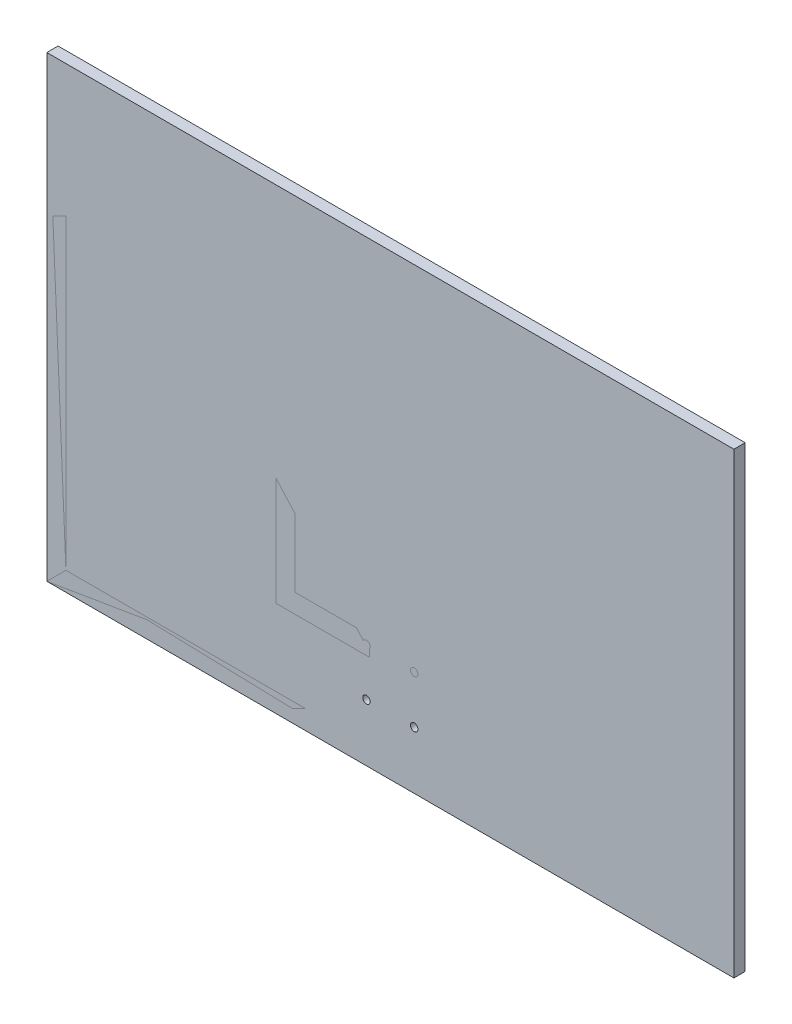
ISO-10303-21;
HEADER;
FILE_DESCRIPTION(('STEP AP214'),'2;1');
FILE_NAME('part.step','',(''),(''),'','','');
FILE_SCHEMA(('AUTOMOTIVE_DESIGN { 1 0 10303 214 1 1 1 1 }'));
ENDSEC;
DATA;
#1=APPLICATION_CONTEXT('core data for automotive mechanical design processes');
#2=APPLICATION_PROTOCOL_DEFINITION('international standard','automotive_design',2000,#1);
#3=PRODUCT_CONTEXT('',#1,'mechanical');
#4=PRODUCT('Part','Part','',(#3));
#5=PRODUCT_RELATED_PRODUCT_CATEGORY('part','',(#4));
#6=PRODUCT_DEFINITION_FORMATION('','',#4);
#7=PRODUCT_DEFINITION_CONTEXT('part definition',#1,'design');
#8=PRODUCT_DEFINITION('design','',#6,#7);
#9=PRODUCT_DEFINITION_SHAPE('','',#8);
#10=(LENGTH_UNIT() NAMED_UNIT(*) SI_UNIT(.MILLI.,.METRE.));
#11=(NAMED_UNIT(*) PLANE_ANGLE_UNIT() SI_UNIT($,.RADIAN.));
#12=(NAMED_UNIT(*) SI_UNIT($,.STERADIAN.) SOLID_ANGLE_UNIT());
#13=UNCERTAINTY_MEASURE_WITH_UNIT(LENGTH_MEASURE(1.E-05),#10,'distance_accuracy_value','');
#14=(GEOMETRIC_REPRESENTATION_CONTEXT(3) GLOBAL_UNCERTAINTY_ASSIGNED_CONTEXT((#13)) GLOBAL_UNIT_ASSIGNED_CONTEXT((#10,
#11,#12)) REPRESENTATION_CONTEXT('',''));
#15=CARTESIAN_POINT('',(0.,0.,0.));
#16=DIRECTION('',(0.,0.,1.));
#17=DIRECTION('',(1.,0.,0.));
#18=AXIS2_PLACEMENT_3D('',#15,#16,#17);
#19=CARTESIAN_POINT('',(0.,0.,30.));
#20=DIRECTION('',(0.,0.,-1.));
#21=DIRECTION('',(-1.,0.,0.));
#22=AXIS2_PLACEMENT_3D('',#19,#20,#21);
#23=PLANE('',#22);
#24=DIRECTION('',(0.,1.,0.));
#25=VECTOR('',#24,1.);
#26=CARTESIAN_POINT('',(-609.7,254.2,30.));
#27=LINE('',#26,#25);
#28=CARTESIAN_POINT('',(-609.7,254.2,30.));
#29=VERTEX_POINT('',#28);
#30=CARTESIAN_POINT('',(-609.7,711.4,30.));
#31=VERTEX_POINT('',#30);
#32=EDGE_CURVE('E84',#29,#31,#27,.T.);
#33=ORIENTED_EDGE('',*,*,#32,.T.);
#34=DIRECTION('',(-1.,0.,0.));
#35=VECTOR('',#34,1.);
#36=CARTESIAN_POINT('',(-1219.3,711.4,30.));
#37=LINE('',#36,#35);
#38=CARTESIAN_POINT('',(-1219.3,711.4,30.));
#39=VERTEX_POINT('',#38);
#40=EDGE_CURVE('E86',#31,#39,#37,.T.);
#41=ORIENTED_EDGE('',*,*,#40,.T.);
#42=DIRECTION('',(0.,-1.,0.));
#43=VECTOR('',#42,1.);
#44=CARTESIAN_POINT('',(-1219.3,254.2,30.));
#45=LINE('',#44,#43);
#46=CARTESIAN_POINT('',(-1219.3,254.2,30.));
#47=VERTEX_POINT('',#46);
#48=EDGE_CURVE('E93',#39,#47,#45,.T.);
#49=ORIENTED_EDGE('',*,*,#48,.T.);
#50=DIRECTION('',(1.,0.,0.));
#51=VECTOR('',#50,1.);
#52=CARTESIAN_POINT('',(-1219.3,254.2,30.));
#53=LINE('',#52,#51);
#54=EDGE_CURVE('E89',#47,#29,#53,.T.);
#55=ORIENTED_EDGE('',*,*,#54,.T.);
#56=EDGE_LOOP('',(#33,#41,#49,#55));
#57=FACE_BOUND('',#56,.T.);
#58=DIRECTION('',(0.,-1.,0.));
#59=VECTOR('',#58,1.);
#60=CARTESIAN_POINT('',(-1168.5,660.6,30.));
#61=LINE('',#60,#59);
#62=CARTESIAN_POINT('',(-1168.5,660.6,30.));
#63=VERTEX_POINT('',#62);
#64=CARTESIAN_POINT('',(-1168.5,305.,30.));
#65=VERTEX_POINT('',#64);
#66=EDGE_CURVE('E60',#63,#65,#61,.T.);
#67=ORIENTED_EDGE('',*,*,#66,.F.);
#68=DIRECTION('',(-1.,0.,0.));
#69=VECTOR('',#68,1.);
#70=CARTESIAN_POINT('',(-1168.5,660.6,30.));
#71=LINE('',#70,#69);
#72=CARTESIAN_POINT('',(-660.5,660.6,30.));
#73=VERTEX_POINT('',#72);
#74=EDGE_CURVE('E104',#73,#63,#71,.T.);
#75=ORIENTED_EDGE('',*,*,#74,.F.);
#76=DIRECTION('',(0.,1.,0.));
#77=VECTOR('',#76,1.);
#78=CARTESIAN_POINT('',(-660.5,660.6,30.));
#79=LINE('',#78,#77);
#80=CARTESIAN_POINT('',(-660.499999999999,305.,30.));
#81=VERTEX_POINT('',#80);
#82=EDGE_CURVE('E56',#81,#73,#79,.T.);
#83=ORIENTED_EDGE('',*,*,#82,.F.);
#84=DIRECTION('',(1.,0.,0.));
#85=VECTOR('',#84,1.);
#86=CARTESIAN_POINT('',(-1168.5,305.,30.));
#87=LINE('',#86,#85);
#88=EDGE_CURVE('E12',#65,#81,#87,.T.);
#89=ORIENTED_EDGE('',*,*,#88,.F.);
#90=EDGE_LOOP('',(#67,#75,#83,#89));
#91=FACE_BOUND('',#90,.T.);
#92=ADVANCED_FACE('F51',(#57,#91),#23,.F.);
#93=OPEN_SHELL('',(#92));
#94=SHELL_BASED_SURFACE_MODEL('B2',(#93));
#95=CARTESIAN_POINT('',(0.,0.,30.));
#96=DIRECTION('',(0.,0.,1.));
#97=DIRECTION('',(1.,0.,0.));
#98=AXIS2_PLACEMENT_3D('',#95,#96,#97);
#99=PLANE('',#98);
#100=DIRECTION('',(0.,-1.,0.));
#101=VECTOR('',#100,1.);
#102=CARTESIAN_POINT('',(-1778.2,1168.2,30.));
#103=LINE('',#102,#101);
#104=CARTESIAN_POINT('',(-1778.2,1168.2,30.));
#105=VERTEX_POINT('',#104);
#106=CARTESIAN_POINT('',(-1778.2,50.8,30.));
#107=VERTEX_POINT('',#106);
#108=EDGE_CURVE('E173',#105,#107,#103,.T.);
#109=ORIENTED_EDGE('',*,*,#108,.F.);
#110=DIRECTION('',(-1.,0.,0.));
#111=VECTOR('',#110,1.);
#112=CARTESIAN_POINT('',(-1778.2,1168.2,30.));
#113=LINE('',#112,#111);
#114=CARTESIAN_POINT('',(-50.8000000000002,1168.2,30.));
#115=VERTEX_POINT('',#114);
#116=EDGE_CURVE('E175',#115,#105,#113,.T.);
#117=ORIENTED_EDGE('',*,*,#116,.F.);
#118=DIRECTION('',(0.,1.,0.));
#119=VECTOR('',#118,1.);
#120=CARTESIAN_POINT('',(-50.8000000000002,1168.2,30.));
#121=LINE('',#120,#119);
#122=CARTESIAN_POINT('',(-50.8000000000002,50.7999999999997,30.));
#123=VERTEX_POINT('',#122);
#124=EDGE_CURVE('E182',#123,#115,#121,.T.);
#125=ORIENTED_EDGE('',*,*,#124,.F.);
#126=DIRECTION('',(1.,0.,0.));
#127=VECTOR('',#126,1.);
#128=CARTESIAN_POINT('',(-1778.2,50.8,30.));
#129=LINE('',#128,#127);
#130=EDGE_CURVE('E178',#107,#123,#129,.T.);
#131=ORIENTED_EDGE('',*,*,#130,.F.);
#132=EDGE_LOOP('',(#109,#117,#125,#131));
#133=FACE_BOUND('',#132,.T.);
#134=DIRECTION('',(0.,-1.,0.));
#135=VECTOR('',#134,1.);
#136=CARTESIAN_POINT('',(-1829.,1219.,30.));
#137=LINE('',#136,#135);
#138=CARTESIAN_POINT('',(-1829.,1219.,30.));
#139=VERTEX_POINT('',#138);
#140=CARTESIAN_POINT('',(-1829.,-2.27661839961493E-13,30.));
#141=VERTEX_POINT('',#140);
#142=EDGE_CURVE('E149',#139,#141,#137,.T.);
#143=ORIENTED_EDGE('',*,*,#142,.T.);
#144=DIRECTION('',(1.,0.,0.));
#145=VECTOR('',#144,1.);
#146=CARTESIAN_POINT('',(-1829.,-2.27661839961493E-13,30.));
#147=LINE('',#146,#145);
#148=CARTESIAN_POINT('',(0.,0.,30.));
#149=VERTEX_POINT('',#148);
#150=EDGE_CURVE('E193',#141,#149,#147,.T.);
#151=ORIENTED_EDGE('',*,*,#150,.T.);
#152=DIRECTION('',(0.,1.,0.));
#153=VECTOR('',#152,1.);
#154=CARTESIAN_POINT('',(0.,1219.,30.));
#155=LINE('',#154,#153);
#156=CARTESIAN_POINT('',(0.,1219.,30.));
#157=VERTEX_POINT('',#156);
#158=EDGE_CURVE('E145',#149,#157,#155,.T.);
#159=ORIENTED_EDGE('',*,*,#158,.T.);
#160=DIRECTION('',(-1.,0.,0.));
#161=VECTOR('',#160,1.);
#162=CARTESIAN_POINT('',(-1829.,1219.,30.));
#163=LINE('',#162,#161);
#164=EDGE_CURVE('E49',#157,#139,#163,.T.);
#165=ORIENTED_EDGE('',*,*,#164,.T.);
#166=EDGE_LOOP('',(#143,#151,#159,#165));
#167=FACE_BOUND('',#166,.T.);
#168=ADVANCED_FACE('F140',(#133,#167),#99,.T.);
#169=OPEN_SHELL('',(#168));
#170=SHELL_BASED_SURFACE_MODEL('B6',(#169));
#171=CARTESIAN_POINT('',(-1829.,0.,0.));
#172=DIRECTION('',(0.,0.,-1.));
#173=DIRECTION('',(-1.,0.,0.));
#174=AXIS2_PLACEMENT_3D('',#171,#172,#173);
#175=PLANE('',#174);
#176=CARTESIAN_POINT('',(-978.,152.6,0.));
#177=DIRECTION('',(0.,0.,1.));
#178=DIRECTION('',(-1.,0.,0.));
#179=AXIS2_PLACEMENT_3D('',#176,#177,#178);
#180=CIRCLE('',#179,10.0000000000001);
#181=CARTESIAN_POINT('',(-988.,152.6,0.));
#182=VERTEX_POINT('',#181);
#183=EDGE_CURVE('E353',#182,#182,#180,.T.);
#184=ORIENTED_EDGE('',*,*,#183,.T.);
#185=EDGE_LOOP('',(#184));
#186=FACE_BOUND('',#185,.T.);
#187=CARTESIAN_POINT('',(-851.,152.6,0.));
#188=DIRECTION('',(0.,0.,1.));
#189=DIRECTION('',(-1.,0.,0.));
#190=AXIS2_PLACEMENT_3D('',#187,#188,#189);
#191=CIRCLE('',#190,10.0000000000001);
#192=CARTESIAN_POINT('',(-861.,152.6,0.));
#193=VERTEX_POINT('',#192);
#194=EDGE_CURVE('E343',#193,#193,#191,.T.);
#195=ORIENTED_EDGE('',*,*,#194,.T.);
#196=EDGE_LOOP('',(#195));
#197=FACE_BOUND('',#196,.T.);
#198=CARTESIAN_POINT('',(-851.,279.6,0.));
#199=DIRECTION('',(0.,0.,1.));
#200=DIRECTION('',(1.,0.,0.));
#201=AXIS2_PLACEMENT_3D('',#198,#199,#200);
#202=CIRCLE('',#201,9.99999999999998);
#203=CARTESIAN_POINT('',(-841.,279.6,0.));
#204=VERTEX_POINT('',#203);
#205=EDGE_CURVE('E338',#204,#204,#202,.T.);
#206=ORIENTED_EDGE('',*,*,#205,.T.);
#207=EDGE_LOOP('',(#206));
#208=FACE_BOUND('',#207,.T.);
#209=CARTESIAN_POINT('',(-978.,279.6,0.));
#210=DIRECTION('',(0.,0.,1.));
#211=DIRECTION('',(1.,0.,0.));
#212=AXIS2_PLACEMENT_3D('',#209,#210,#211);
#213=CIRCLE('',#212,9.99999999999998);
#214=CARTESIAN_POINT('',(-968.,279.6,0.));
#215=VERTEX_POINT('',#214);
#216=EDGE_CURVE('E289',#215,#215,#213,.T.);
#217=ORIENTED_EDGE('',*,*,#216,.T.);
#218=EDGE_LOOP('',(#217));
#219=FACE_BOUND('',#218,.T.);
#220=DIRECTION('',(0.,1.,0.));
#221=VECTOR('',#220,1.);
#222=CARTESIAN_POINT('',(0.,0.,0.));
#223=LINE('',#222,#221);
#224=CARTESIAN_POINT('',(0.,0.,0.));
#225=VERTEX_POINT('',#224);
#226=CARTESIAN_POINT('',(0.,1219.,0.));
#227=VERTEX_POINT('',#226);
#228=EDGE_CURVE('E285',#225,#227,#223,.T.);
#229=ORIENTED_EDGE('',*,*,#228,.F.);
#230=DIRECTION('',(1.,0.,0.));
#231=VECTOR('',#230,1.);
#232=CARTESIAN_POINT('',(-1829.,0.,0.));
#233=LINE('',#232,#231);
#234=CARTESIAN_POINT('',(-1829.,0.,0.));
#235=VERTEX_POINT('',#234);
#236=EDGE_CURVE('E138',#235,#225,#233,.T.);
#237=ORIENTED_EDGE('',*,*,#236,.F.);
#238=DIRECTION('',(0.,1.,0.));
#239=VECTOR('',#238,1.);
#240=CARTESIAN_POINT('',(-1829.,0.,0.));
#241=LINE('',#240,#239);
#242=CARTESIAN_POINT('',(-1829.,1219.,0.));
#243=VERTEX_POINT('',#242);
#244=EDGE_CURVE('E278',#235,#243,#241,.T.);
#245=ORIENTED_EDGE('',*,*,#244,.T.);
#246=DIRECTION('',(1.,0.,0.));
#247=VECTOR('',#246,1.);
#248=CARTESIAN_POINT('',(-1829.,1219.,0.));
#249=LINE('',#248,#247);
#250=EDGE_CURVE('E223',#243,#227,#249,.T.);
#251=ORIENTED_EDGE('',*,*,#250,.T.);
#252=EDGE_LOOP('',(#229,#237,#245,#251));
#253=FACE_BOUND('',#252,.T.);
#254=ADVANCED_FACE('F220',(#186,#197,#208,#219,#253),#175,.T.);
#255=CARTESIAN_POINT('',(-1829.,0.,0.));
#256=DIRECTION('',(0.,-1.,0.));
#257=DIRECTION('',(0.,0.,-1.));
#258=AXIS2_PLACEMENT_3D('',#255,#256,#257);
#259=PLANE('',#258);
#260=DIRECTION('',(0.,0.,-1.));
#261=VECTOR('',#260,1.);
#262=CARTESIAN_POINT('',(0.,0.,0.));
#263=LINE('',#262,#261);
#264=CARTESIAN_POINT('',(0.,0.,30.));
#265=VERTEX_POINT('',#264);
#266=EDGE_CURVE('E280',#265,#225,#263,.T.);
#267=ORIENTED_EDGE('',*,*,#266,.F.);
#268=DIRECTION('',(1.,0.,0.));
#269=VECTOR('',#268,1.);
#270=CARTESIAN_POINT('',(-1829.,0.,30.));
#271=LINE('',#270,#269);
#272=CARTESIAN_POINT('',(-1829.,0.,30.));
#273=VERTEX_POINT('',#272);
#274=EDGE_CURVE('E229',#273,#265,#271,.T.);
#275=ORIENTED_EDGE('',*,*,#274,.F.);
#276=DIRECTION('',(0.,0.,-1.));
#277=VECTOR('',#276,1.);
#278=CARTESIAN_POINT('',(-1829.,0.,0.));
#279=LINE('',#278,#277);
#280=EDGE_CURVE('E275',#273,#235,#279,.T.);
#281=ORIENTED_EDGE('',*,*,#280,.T.);
#282=ORIENTED_EDGE('',*,*,#236,.T.);
#283=EDGE_LOOP('',(#267,#275,#281,#282));
#284=FACE_BOUND('',#283,.T.);
#285=ADVANCED_FACE('F296',(#284),#259,.T.);
#286=CARTESIAN_POINT('',(-1829.,0.,30.));
#287=DIRECTION('',(0.,0.,1.));
#288=DIRECTION('',(1.,0.,0.));
#289=AXIS2_PLACEMENT_3D('',#286,#287,#288);
#290=PLANE('',#289);
#291=CARTESIAN_POINT('',(-978.,152.6,30.));
#292=DIRECTION('',(0.,0.,1.));
#293=DIRECTION('',(-1.,0.,0.));
#294=AXIS2_PLACEMENT_3D('',#291,#292,#293);
#295=CIRCLE('',#294,10.0000000000001);
#296=CARTESIAN_POINT('',(-988.,152.6,30.));
#297=VERTEX_POINT('',#296);
#298=EDGE_CURVE('E356',#297,#297,#295,.T.);
#299=ORIENTED_EDGE('',*,*,#298,.F.);
#300=EDGE_LOOP('',(#299));
#301=FACE_BOUND('',#300,.T.);
#302=CARTESIAN_POINT('',(-851.,152.6,30.));
#303=DIRECTION('',(0.,0.,1.));
#304=DIRECTION('',(-1.,0.,0.));
#305=AXIS2_PLACEMENT_3D('',#302,#303,#304);
#306=CIRCLE('',#305,10.0000000000001);
#307=CARTESIAN_POINT('',(-861.,152.6,30.));
#308=VERTEX_POINT('',#307);
#309=EDGE_CURVE('E348',#308,#308,#306,.T.);
#310=ORIENTED_EDGE('',*,*,#309,.F.);
#311=EDGE_LOOP('',(#310));
#312=FACE_BOUND('',#311,.T.);
#313=CARTESIAN_POINT('',(-851.,279.6,30.));
#314=DIRECTION('',(0.,0.,1.));
#315=DIRECTION('',(1.,0.,0.));
#316=AXIS2_PLACEMENT_3D('',#313,#314,#315);
#317=CIRCLE('',#316,9.99999999999998);
#318=CARTESIAN_POINT('',(-841.,279.6,30.));
#319=VERTEX_POINT('',#318);
#320=EDGE_CURVE('E341',#319,#319,#317,.T.);
#321=ORIENTED_EDGE('',*,*,#320,.F.);
#322=EDGE_LOOP('',(#321));
#323=FACE_BOUND('',#322,.T.);
#324=CARTESIAN_POINT('',(-978.,279.6,30.));
#325=DIRECTION('',(0.,0.,1.));
#326=DIRECTION('',(1.,0.,0.));
#327=AXIS2_PLACEMENT_3D('',#324,#325,#326);
#328=CIRCLE('',#327,9.99999999999998);
#329=CARTESIAN_POINT('',(-968.,279.6,30.));
#330=VERTEX_POINT('',#329);
#331=EDGE_CURVE('E345',#330,#330,#328,.T.);
#332=ORIENTED_EDGE('',*,*,#331,.F.);
#333=EDGE_LOOP('',(#332));
#334=FACE_BOUND('',#333,.T.);
#335=DIRECTION('',(0.,-1.,0.));
#336=VECTOR('',#335,1.);
#337=CARTESIAN_POINT('',(0.,0.,30.));
#338=LINE('',#337,#336);
#339=CARTESIAN_POINT('',(0.,1219.,30.));
#340=VERTEX_POINT('',#339);
#341=EDGE_CURVE('E270',#340,#265,#338,.T.);
#342=ORIENTED_EDGE('',*,*,#341,.F.);
#343=DIRECTION('',(1.,0.,0.));
#344=VECTOR('',#343,1.);
#345=CARTESIAN_POINT('',(-1829.,1219.,30.));
#346=LINE('',#345,#344);
#347=CARTESIAN_POINT('',(-1829.,1219.,30.));
#348=VERTEX_POINT('',#347);
#349=EDGE_CURVE('E265',#348,#340,#346,.T.);
#350=ORIENTED_EDGE('',*,*,#349,.F.);
#351=DIRECTION('',(0.,-1.,0.));
#352=VECTOR('',#351,1.);
#353=CARTESIAN_POINT('',(-1829.,0.,30.));
#354=LINE('',#353,#352);
#355=EDGE_CURVE('E268',#348,#273,#354,.T.);
#356=ORIENTED_EDGE('',*,*,#355,.T.);
#357=ORIENTED_EDGE('',*,*,#274,.T.);
#358=EDGE_LOOP('',(#342,#350,#356,#357));
#359=FACE_BOUND('',#358,.T.);
#360=ADVANCED_FACE('F267',(#301,#312,#323,#334,#359),#290,.T.);
#361=CARTESIAN_POINT('',(-1829.,1219.,0.));
#362=DIRECTION('',(0.,1.,0.));
#363=DIRECTION('',(0.,0.,1.));
#364=AXIS2_PLACEMENT_3D('',#361,#362,#363);
#365=PLANE('',#364);
#366=DIRECTION('',(0.,0.,1.));
#367=VECTOR('',#366,1.);
#368=CARTESIAN_POINT('',(0.,1219.,0.));
#369=LINE('',#368,#367);
#370=EDGE_CURVE('E288',#227,#340,#369,.T.);
#371=ORIENTED_EDGE('',*,*,#370,.F.);
#372=ORIENTED_EDGE('',*,*,#250,.F.);
#373=DIRECTION('',(0.,0.,1.));
#374=VECTOR('',#373,1.);
#375=CARTESIAN_POINT('',(-1829.,1219.,0.));
#376=LINE('',#375,#374);
#377=EDGE_CURVE('E274',#243,#348,#376,.T.);
#378=ORIENTED_EDGE('',*,*,#377,.T.);
#379=ORIENTED_EDGE('',*,*,#349,.T.);
#380=EDGE_LOOP('',(#371,#372,#378,#379));
#381=FACE_BOUND('',#380,.T.);
#382=ADVANCED_FACE('F277',(#381),#365,.T.);
#383=CARTESIAN_POINT('',(-1829.,0.,0.));
#384=DIRECTION('',(1.,0.,0.));
#385=DIRECTION('',(0.,0.,-1.));
#386=AXIS2_PLACEMENT_3D('',#383,#384,#385);
#387=PLANE('',#386);
#388=ORIENTED_EDGE('',*,*,#244,.F.);
#389=ORIENTED_EDGE('',*,*,#280,.F.);
#390=ORIENTED_EDGE('',*,*,#355,.F.);
#391=ORIENTED_EDGE('',*,*,#377,.F.);
#392=EDGE_LOOP('',(#388,#389,#390,#391));
#393=FACE_BOUND('',#392,.T.);
#394=ADVANCED_FACE('F273',(#393),#387,.F.);
#395=CARTESIAN_POINT('',(0.,0.,0.));
#396=DIRECTION('',(1.,0.,0.));
#397=DIRECTION('',(0.,0.,-1.));
#398=AXIS2_PLACEMENT_3D('',#395,#396,#397);
#399=PLANE('',#398);
#400=ORIENTED_EDGE('',*,*,#228,.T.);
#401=ORIENTED_EDGE('',*,*,#370,.T.);
#402=ORIENTED_EDGE('',*,*,#341,.T.);
#403=ORIENTED_EDGE('',*,*,#266,.T.);
#404=EDGE_LOOP('',(#400,#401,#402,#403));
#405=FACE_BOUND('',#404,.T.);
#406=ADVANCED_FACE('F295',(#405),#399,.T.);
#407=CARTESIAN_POINT('',(-978.,279.6,0.));
#408=DIRECTION('',(0.,0.,1.));
#409=DIRECTION('',(1.,0.,0.));
#410=AXIS2_PLACEMENT_3D('',#407,#408,#409);
#411=CYLINDRICAL_SURFACE('',#410,9.99999999999998);
#412=ORIENTED_EDGE('',*,*,#216,.F.);
#413=EDGE_LOOP('',(#412));
#414=FACE_BOUND('',#413,.T.);
#415=ORIENTED_EDGE('',*,*,#331,.T.);
#416=EDGE_LOOP('',(#415));
#417=FACE_BOUND('',#416,.T.);
#418=ADVANCED_FACE('F317',(#414,#417),#411,.F.);
#419=CARTESIAN_POINT('',(-851.,279.6,0.));
#420=DIRECTION('',(0.,0.,1.));
#421=DIRECTION('',(1.,0.,0.));
#422=AXIS2_PLACEMENT_3D('',#419,#420,#421);
#423=CYLINDRICAL_SURFACE('',#422,9.99999999999998);
#424=ORIENTED_EDGE('',*,*,#205,.F.);
#425=EDGE_LOOP('',(#424));
#426=FACE_BOUND('',#425,.T.);
#427=ORIENTED_EDGE('',*,*,#320,.T.);
#428=EDGE_LOOP('',(#427));
#429=FACE_BOUND('',#428,.T.);
#430=ADVANCED_FACE('F321',(#426,#429),#423,.F.);
#431=CARTESIAN_POINT('',(-851.,152.6,0.));
#432=DIRECTION('',(0.,0.,1.));
#433=DIRECTION('',(1.,0.,0.));
#434=AXIS2_PLACEMENT_3D('',#431,#432,#433);
#435=CYLINDRICAL_SURFACE('',#434,10.0000000000001);
#436=ORIENTED_EDGE('',*,*,#194,.F.);
#437=EDGE_LOOP('',(#436));
#438=FACE_BOUND('',#437,.T.);
#439=ORIENTED_EDGE('',*,*,#309,.T.);
#440=EDGE_LOOP('',(#439));
#441=FACE_BOUND('',#440,.T.);
#442=ADVANCED_FACE('F326',(#438,#441),#435,.F.);
#443=CARTESIAN_POINT('',(-978.,152.6,0.));
#444=DIRECTION('',(0.,0.,1.));
#445=DIRECTION('',(1.,0.,0.));
#446=AXIS2_PLACEMENT_3D('',#443,#444,#445);
#447=CYLINDRICAL_SURFACE('',#446,10.0000000000001);
#448=ORIENTED_EDGE('',*,*,#183,.F.);
#449=EDGE_LOOP('',(#448));
#450=FACE_BOUND('',#449,.T.);
#451=ORIENTED_EDGE('',*,*,#298,.T.);
#452=EDGE_LOOP('',(#451));
#453=FACE_BOUND('',#452,.T.);
#454=ADVANCED_FACE('F323',(#450,#453),#447,.F.);
#455=CLOSED_SHELL('',(#254,#285,#360,#382,#394,#406,#418,#430,#442,#454));
#456=MANIFOLD_SOLID_BREP('B43',#455);
#457=ADVANCED_BREP_SHAPE_REPRESENTATION('',(#18,#456),#14);
#458=MANIFOLD_SURFACE_SHAPE_REPRESENTATION('',(#18,#94,#170),#14);
#459=SHAPE_REPRESENTATION('',(#18),#14);
#460=SHAPE_DEFINITION_REPRESENTATION(#9,#459);
#461=SHAPE_REPRESENTATION_RELATIONSHIP('','',#459,#457);
#462=SHAPE_REPRESENTATION_RELATIONSHIP('','',#459,#458);
ENDSEC;
END-ISO-10303-21;
